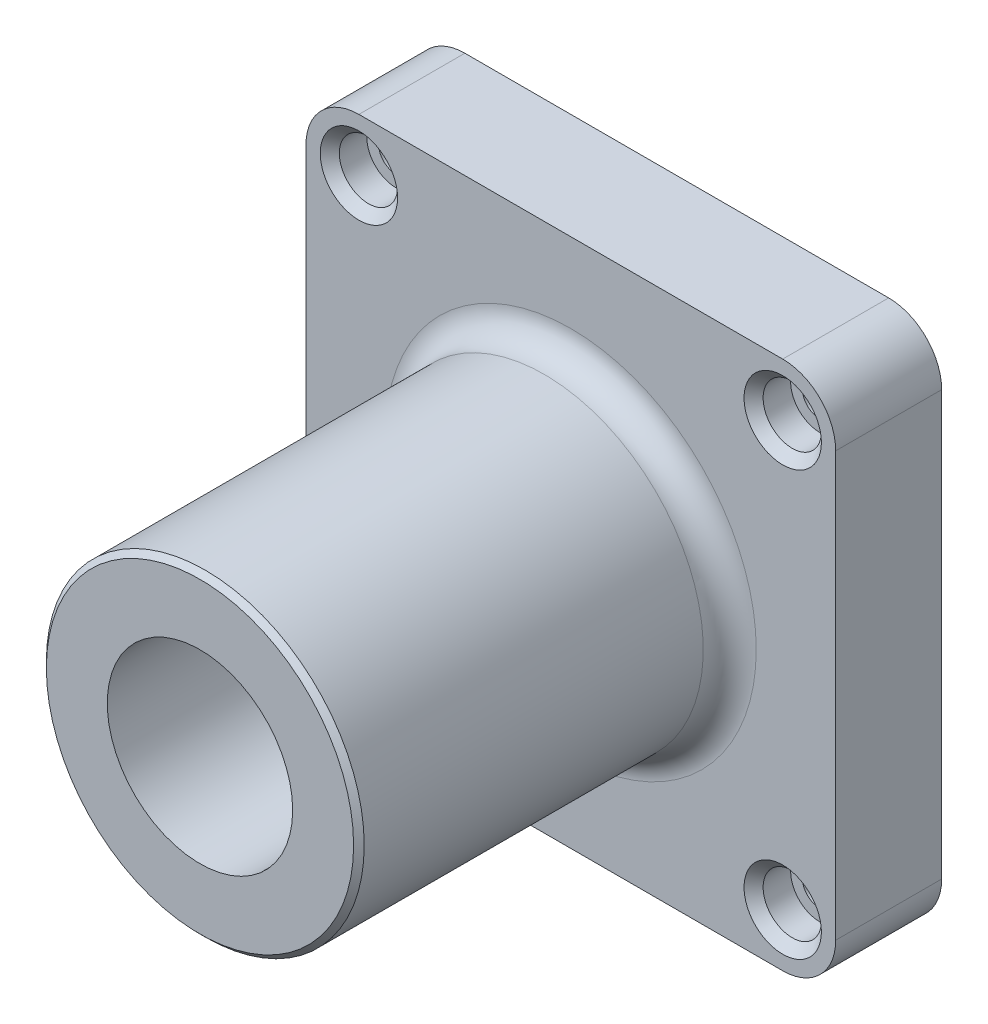
ISO-10303-21;
HEADER;
FILE_DESCRIPTION(('STEP AP214'),'2;1');
FILE_NAME('part.step','',(''),(''),'','','');
FILE_SCHEMA(('AUTOMOTIVE_DESIGN { 1 0 10303 214 1 1 1 1 }'));
ENDSEC;
DATA;
#1=APPLICATION_CONTEXT('core data for automotive mechanical design processes');
#2=APPLICATION_PROTOCOL_DEFINITION('international standard','automotive_design',2000,#1);
#3=PRODUCT_CONTEXT('',#1,'mechanical');
#4=PRODUCT('Part','Part','',(#3));
#5=PRODUCT_RELATED_PRODUCT_CATEGORY('part','',(#4));
#6=PRODUCT_DEFINITION_FORMATION('','',#4);
#7=PRODUCT_DEFINITION_CONTEXT('part definition',#1,'design');
#8=PRODUCT_DEFINITION('design','',#6,#7);
#9=PRODUCT_DEFINITION_SHAPE('','',#8);
#10=(LENGTH_UNIT() NAMED_UNIT(*) SI_UNIT(.MILLI.,.METRE.));
#11=(NAMED_UNIT(*) PLANE_ANGLE_UNIT() SI_UNIT($,.RADIAN.));
#12=(NAMED_UNIT(*) SI_UNIT($,.STERADIAN.) SOLID_ANGLE_UNIT());
#13=UNCERTAINTY_MEASURE_WITH_UNIT(LENGTH_MEASURE(1.E-05),#10,'distance_accuracy_value','');
#14=(GEOMETRIC_REPRESENTATION_CONTEXT(3) GLOBAL_UNCERTAINTY_ASSIGNED_CONTEXT((#13)) GLOBAL_UNIT_ASSIGNED_CONTEXT((#10,
#11,#12)) REPRESENTATION_CONTEXT('',''));
#15=CARTESIAN_POINT('',(0.,0.,0.));
#16=DIRECTION('',(0.,0.,1.));
#17=DIRECTION('',(1.,0.,0.));
#18=AXIS2_PLACEMENT_3D('',#15,#16,#17);
#19=CARTESIAN_POINT('',(0.,0.,20.));
#20=DIRECTION('',(1.,0.,0.));
#21=DIRECTION('',(0.,0.,-1.));
#22=AXIS2_PLACEMENT_3D('',#19,#20,#21);
#23=PLANE('',#22);
#24=DIRECTION('',(0.,-1.,0.));
#25=VECTOR('',#24,1.);
#26=CARTESIAN_POINT('',(0.,0.,0.));
#27=LINE('',#26,#25);
#28=CARTESIAN_POINT('',(0.,90.,0.));
#29=VERTEX_POINT('',#28);
#30=CARTESIAN_POINT('',(0.,10.,0.));
#31=VERTEX_POINT('',#30);
#32=EDGE_CURVE('E173',#29,#31,#27,.T.);
#33=ORIENTED_EDGE('',*,*,#32,.T.);
#34=DIRECTION('',(0.,0.,-1.));
#35=VECTOR('',#34,1.);
#36=CARTESIAN_POINT('',(0.,10.,20.));
#37=LINE('',#36,#35);
#38=CARTESIAN_POINT('',(0.,10.,20.));
#39=VERTEX_POINT('',#38);
#40=EDGE_CURVE('E11',#31,#39,#37,.F.);
#41=ORIENTED_EDGE('',*,*,#40,.T.);
#42=DIRECTION('',(0.,-1.,0.));
#43=VECTOR('',#42,1.);
#44=CARTESIAN_POINT('',(0.,0.,20.));
#45=LINE('',#44,#43);
#46=CARTESIAN_POINT('',(0.,90.,20.));
#47=VERTEX_POINT('',#46);
#48=EDGE_CURVE('E129',#47,#39,#45,.T.);
#49=ORIENTED_EDGE('',*,*,#48,.F.);
#50=DIRECTION('',(0.,0.,-1.));
#51=VECTOR('',#50,1.);
#52=CARTESIAN_POINT('',(0.,90.,20.));
#53=LINE('',#52,#51);
#54=EDGE_CURVE('E45',#47,#29,#53,.T.);
#55=ORIENTED_EDGE('',*,*,#54,.T.);
#56=EDGE_LOOP('',(#33,#41,#49,#55));
#57=FACE_BOUND('',#56,.T.);
#58=ADVANCED_FACE('F37',(#57),#23,.F.);
#59=CARTESIAN_POINT('',(0.,0.,20.));
#60=DIRECTION('',(0.,1.,0.));
#61=DIRECTION('',(0.,0.,1.));
#62=AXIS2_PLACEMENT_3D('',#59,#60,#61);
#63=PLANE('',#62);
#64=DIRECTION('',(1.,0.,0.));
#65=VECTOR('',#64,1.);
#66=CARTESIAN_POINT('',(0.,0.,0.));
#67=LINE('',#66,#65);
#68=CARTESIAN_POINT('',(10.,0.,0.));
#69=VERTEX_POINT('',#68);
#70=CARTESIAN_POINT('',(90.,0.,0.));
#71=VERTEX_POINT('',#70);
#72=EDGE_CURVE('E134',#69,#71,#67,.T.);
#73=ORIENTED_EDGE('',*,*,#72,.T.);
#74=DIRECTION('',(0.,0.,-1.));
#75=VECTOR('',#74,1.);
#76=CARTESIAN_POINT('',(90.,0.,20.));
#77=LINE('',#76,#75);
#78=CARTESIAN_POINT('',(90.,0.,20.));
#79=VERTEX_POINT('',#78);
#80=EDGE_CURVE('E52',#71,#79,#77,.F.);
#81=ORIENTED_EDGE('',*,*,#80,.T.);
#82=DIRECTION('',(1.,0.,0.));
#83=VECTOR('',#82,1.);
#84=CARTESIAN_POINT('',(0.,0.,20.));
#85=LINE('',#84,#83);
#86=CARTESIAN_POINT('',(10.,0.,20.));
#87=VERTEX_POINT('',#86);
#88=EDGE_CURVE('E132',#87,#79,#85,.T.);
#89=ORIENTED_EDGE('',*,*,#88,.F.);
#90=DIRECTION('',(0.,0.,-1.));
#91=VECTOR('',#90,1.);
#92=CARTESIAN_POINT('',(10.,0.,20.));
#93=LINE('',#92,#91);
#94=EDGE_CURVE('E165',#87,#69,#93,.T.);
#95=ORIENTED_EDGE('',*,*,#94,.T.);
#96=EDGE_LOOP('',(#73,#81,#89,#95));
#97=FACE_BOUND('',#96,.T.);
#98=ADVANCED_FACE('F274',(#97),#63,.F.);
#99=CARTESIAN_POINT('',(100.,0.,20.));
#100=DIRECTION('',(-1.,0.,0.));
#101=DIRECTION('',(0.,0.,1.));
#102=AXIS2_PLACEMENT_3D('',#99,#100,#101);
#103=PLANE('',#102);
#104=DIRECTION('',(0.,1.,0.));
#105=VECTOR('',#104,1.);
#106=CARTESIAN_POINT('',(100.,0.,0.));
#107=LINE('',#106,#105);
#108=CARTESIAN_POINT('',(100.,10.,0.));
#109=VERTEX_POINT('',#108);
#110=CARTESIAN_POINT('',(100.,90.,0.));
#111=VERTEX_POINT('',#110);
#112=EDGE_CURVE('E130',#109,#111,#107,.T.);
#113=ORIENTED_EDGE('',*,*,#112,.T.);
#114=DIRECTION('',(0.,0.,-1.));
#115=VECTOR('',#114,1.);
#116=CARTESIAN_POINT('',(100.,90.,20.));
#117=LINE('',#116,#115);
#118=CARTESIAN_POINT('',(100.,90.,20.));
#119=VERTEX_POINT('',#118);
#120=EDGE_CURVE('E108',#111,#119,#117,.F.);
#121=ORIENTED_EDGE('',*,*,#120,.T.);
#122=DIRECTION('',(0.,1.,0.));
#123=VECTOR('',#122,1.);
#124=CARTESIAN_POINT('',(100.,0.,20.));
#125=LINE('',#124,#123);
#126=CARTESIAN_POINT('',(100.,10.,20.));
#127=VERTEX_POINT('',#126);
#128=EDGE_CURVE('E185',#127,#119,#125,.T.);
#129=ORIENTED_EDGE('',*,*,#128,.F.);
#130=DIRECTION('',(0.,0.,-1.));
#131=VECTOR('',#130,1.);
#132=CARTESIAN_POINT('',(100.,10.,20.));
#133=LINE('',#132,#131);
#134=EDGE_CURVE('E113',#127,#109,#133,.T.);
#135=ORIENTED_EDGE('',*,*,#134,.T.);
#136=EDGE_LOOP('',(#113,#121,#129,#135));
#137=FACE_BOUND('',#136,.T.);
#138=ADVANCED_FACE('F279',(#137),#103,.F.);
#139=CARTESIAN_POINT('',(0.,100.,20.));
#140=DIRECTION('',(0.,-1.,0.));
#141=DIRECTION('',(0.,0.,-1.));
#142=AXIS2_PLACEMENT_3D('',#139,#140,#141);
#143=PLANE('',#142);
#144=DIRECTION('',(-1.,0.,0.));
#145=VECTOR('',#144,1.);
#146=CARTESIAN_POINT('',(0.,100.,20.));
#147=LINE('',#146,#145);
#148=CARTESIAN_POINT('',(90.,100.,20.));
#149=VERTEX_POINT('',#148);
#150=CARTESIAN_POINT('',(10.,100.,20.));
#151=VERTEX_POINT('',#150);
#152=EDGE_CURVE('E123',#149,#151,#147,.T.);
#153=ORIENTED_EDGE('',*,*,#152,.F.);
#154=DIRECTION('',(0.,0.,-1.));
#155=VECTOR('',#154,1.);
#156=CARTESIAN_POINT('',(90.,100.,20.));
#157=LINE('',#156,#155);
#158=CARTESIAN_POINT('',(90.,100.,0.));
#159=VERTEX_POINT('',#158);
#160=EDGE_CURVE('E107',#149,#159,#157,.T.);
#161=ORIENTED_EDGE('',*,*,#160,.T.);
#162=DIRECTION('',(-1.,0.,0.));
#163=VECTOR('',#162,1.);
#164=CARTESIAN_POINT('',(0.,100.,0.));
#165=LINE('',#164,#163);
#166=CARTESIAN_POINT('',(10.,100.,0.));
#167=VERTEX_POINT('',#166);
#168=EDGE_CURVE('E120',#159,#167,#165,.T.);
#169=ORIENTED_EDGE('',*,*,#168,.T.);
#170=DIRECTION('',(0.,0.,-1.));
#171=VECTOR('',#170,1.);
#172=CARTESIAN_POINT('',(10.,100.,20.));
#173=LINE('',#172,#171);
#174=EDGE_CURVE('E125',#167,#151,#173,.F.);
#175=ORIENTED_EDGE('',*,*,#174,.T.);
#176=EDGE_LOOP('',(#153,#161,#169,#175));
#177=FACE_BOUND('',#176,.T.);
#178=ADVANCED_FACE('F119',(#177),#143,.F.);
#179=CARTESIAN_POINT('',(0.,0.,20.));
#180=DIRECTION('',(0.,0.,-1.));
#181=DIRECTION('',(-1.,0.,0.));
#182=AXIS2_PLACEMENT_3D('',#179,#180,#181);
#183=PLANE('',#182);
#184=CARTESIAN_POINT('',(10.,90.,20.));
#185=DIRECTION('',(0.,0.,1.));
#186=DIRECTION('',(1.,0.,0.));
#187=AXIS2_PLACEMENT_3D('',#184,#185,#186);
#188=CIRCLE('',#187,7.3);
#189=CARTESIAN_POINT('',(17.3,90.,20.));
#190=VERTEX_POINT('',#189);
#191=EDGE_CURVE('E242',#190,#190,#188,.T.);
#192=ORIENTED_EDGE('',*,*,#191,.F.);
#193=EDGE_LOOP('',(#192));
#194=FACE_BOUND('',#193,.T.);
#195=CARTESIAN_POINT('',(10.,10.,20.));
#196=DIRECTION('',(0.,0.,1.));
#197=DIRECTION('',(1.,0.,0.));
#198=AXIS2_PLACEMENT_3D('',#195,#196,#197);
#199=CIRCLE('',#198,7.3);
#200=CARTESIAN_POINT('',(17.3,10.,20.));
#201=VERTEX_POINT('',#200);
#202=EDGE_CURVE('E227',#201,#201,#199,.T.);
#203=ORIENTED_EDGE('',*,*,#202,.F.);
#204=EDGE_LOOP('',(#203));
#205=FACE_BOUND('',#204,.T.);
#206=CARTESIAN_POINT('',(90.,10.,20.));
#207=DIRECTION('',(0.,0.,1.));
#208=DIRECTION('',(1.,0.,0.));
#209=AXIS2_PLACEMENT_3D('',#206,#207,#208);
#210=CIRCLE('',#209,7.3);
#211=CARTESIAN_POINT('',(97.3,10.,20.));
#212=VERTEX_POINT('',#211);
#213=EDGE_CURVE('E212',#212,#212,#210,.T.);
#214=ORIENTED_EDGE('',*,*,#213,.F.);
#215=EDGE_LOOP('',(#214));
#216=FACE_BOUND('',#215,.T.);
#217=CARTESIAN_POINT('',(90.,90.,20.));
#218=DIRECTION('',(0.,0.,1.));
#219=DIRECTION('',(1.,0.,0.));
#220=AXIS2_PLACEMENT_3D('',#217,#218,#219);
#221=CIRCLE('',#220,7.3);
#222=CARTESIAN_POINT('',(97.3,90.,20.));
#223=VERTEX_POINT('',#222);
#224=EDGE_CURVE('E197',#223,#223,#221,.T.);
#225=ORIENTED_EDGE('',*,*,#224,.F.);
#226=EDGE_LOOP('',(#225));
#227=FACE_BOUND('',#226,.T.);
#228=CARTESIAN_POINT('',(50.,50.,20.));
#229=DIRECTION('',(0.,0.,-1.));
#230=DIRECTION('',(-1.,0.,0.));
#231=AXIS2_PLACEMENT_3D('',#228,#229,#230);
#232=CIRCLE('',#231,35.);
#233=CARTESIAN_POINT('',(15.,50.,20.));
#234=VERTEX_POINT('',#233);
#235=EDGE_CURVE('E141',#234,#234,#232,.T.);
#236=ORIENTED_EDGE('',*,*,#235,.T.);
#237=EDGE_LOOP('',(#236));
#238=FACE_BOUND('',#237,.T.);
#239=ORIENTED_EDGE('',*,*,#128,.T.);
#240=CARTESIAN_POINT('',(90.,90.,20.));
#241=DIRECTION('',(0.,0.,-1.));
#242=DIRECTION('',(-1.,0.,0.));
#243=AXIS2_PLACEMENT_3D('',#240,#241,#242);
#244=CIRCLE('',#243,10.);
#245=EDGE_CURVE('E163',#119,#149,#244,.F.);
#246=ORIENTED_EDGE('',*,*,#245,.T.);
#247=ORIENTED_EDGE('',*,*,#152,.T.);
#248=CARTESIAN_POINT('',(10.,90.,20.));
#249=DIRECTION('',(0.,0.,-1.));
#250=DIRECTION('',(-1.,0.,0.));
#251=AXIS2_PLACEMENT_3D('',#248,#249,#250);
#252=CIRCLE('',#251,10.);
#253=EDGE_CURVE('E158',#151,#47,#252,.F.);
#254=ORIENTED_EDGE('',*,*,#253,.T.);
#255=ORIENTED_EDGE('',*,*,#48,.T.);
#256=CARTESIAN_POINT('',(10.,10.,20.));
#257=DIRECTION('',(0.,0.,-1.));
#258=DIRECTION('',(-1.,0.,0.));
#259=AXIS2_PLACEMENT_3D('',#256,#257,#258);
#260=CIRCLE('',#259,10.);
#261=EDGE_CURVE('E59',#39,#87,#260,.F.);
#262=ORIENTED_EDGE('',*,*,#261,.T.);
#263=ORIENTED_EDGE('',*,*,#88,.T.);
#264=CARTESIAN_POINT('',(90.,10.,20.));
#265=DIRECTION('',(0.,0.,-1.));
#266=DIRECTION('',(-1.,0.,0.));
#267=AXIS2_PLACEMENT_3D('',#264,#265,#266);
#268=CIRCLE('',#267,10.);
#269=EDGE_CURVE('E161',#79,#127,#268,.F.);
#270=ORIENTED_EDGE('',*,*,#269,.T.);
#271=EDGE_LOOP('',(#239,#246,#247,#254,#255,#262,#263,#270));
#272=FACE_BOUND('',#271,.T.);
#273=ADVANCED_FACE('F312',(#194,#205,#216,#227,#238,#272),#183,.F.);
#274=CARTESIAN_POINT('',(0.,0.,0.));
#275=DIRECTION('',(0.,0.,-1.));
#276=DIRECTION('',(-1.,0.,0.));
#277=AXIS2_PLACEMENT_3D('',#274,#275,#276);
#278=PLANE('',#277);
#279=CARTESIAN_POINT('',(50.,50.,0.));
#280=DIRECTION('',(0.,0.,1.));
#281=DIRECTION('',(1.,0.,0.));
#282=AXIS2_PLACEMENT_3D('',#279,#280,#281);
#283=CIRCLE('',#282,22.5);
#284=CARTESIAN_POINT('',(72.5,50.,0.));
#285=VERTEX_POINT('',#284);
#286=EDGE_CURVE('E251',#285,#285,#283,.T.);
#287=ORIENTED_EDGE('',*,*,#286,.T.);
#288=EDGE_LOOP('',(#287));
#289=FACE_BOUND('',#288,.T.);
#290=CARTESIAN_POINT('',(10.,90.,0.));
#291=DIRECTION('',(0.,0.,1.));
#292=DIRECTION('',(1.,0.,0.));
#293=AXIS2_PLACEMENT_3D('',#290,#291,#292);
#294=CIRCLE('',#293,3.3);
#295=CARTESIAN_POINT('',(13.3,90.,0.));
#296=VERTEX_POINT('',#295);
#297=EDGE_CURVE('E230',#296,#296,#294,.T.);
#298=ORIENTED_EDGE('',*,*,#297,.T.);
#299=EDGE_LOOP('',(#298));
#300=FACE_BOUND('',#299,.T.);
#301=CARTESIAN_POINT('',(10.,10.,0.));
#302=DIRECTION('',(0.,0.,1.));
#303=DIRECTION('',(1.,0.,0.));
#304=AXIS2_PLACEMENT_3D('',#301,#302,#303);
#305=CIRCLE('',#304,3.3);
#306=CARTESIAN_POINT('',(13.3,10.,0.));
#307=VERTEX_POINT('',#306);
#308=EDGE_CURVE('E215',#307,#307,#305,.T.);
#309=ORIENTED_EDGE('',*,*,#308,.T.);
#310=EDGE_LOOP('',(#309));
#311=FACE_BOUND('',#310,.T.);
#312=CARTESIAN_POINT('',(90.,10.,0.));
#313=DIRECTION('',(0.,0.,1.));
#314=DIRECTION('',(1.,0.,0.));
#315=AXIS2_PLACEMENT_3D('',#312,#313,#314);
#316=CIRCLE('',#315,3.3);
#317=CARTESIAN_POINT('',(93.3,10.,0.));
#318=VERTEX_POINT('',#317);
#319=EDGE_CURVE('E200',#318,#318,#316,.T.);
#320=ORIENTED_EDGE('',*,*,#319,.T.);
#321=EDGE_LOOP('',(#320));
#322=FACE_BOUND('',#321,.T.);
#323=CARTESIAN_POINT('',(90.,90.,0.));
#324=DIRECTION('',(0.,0.,1.));
#325=DIRECTION('',(1.,0.,0.));
#326=AXIS2_PLACEMENT_3D('',#323,#324,#325);
#327=CIRCLE('',#326,3.3);
#328=CARTESIAN_POINT('',(93.3,90.,0.));
#329=VERTEX_POINT('',#328);
#330=EDGE_CURVE('E178',#329,#329,#327,.T.);
#331=ORIENTED_EDGE('',*,*,#330,.T.);
#332=EDGE_LOOP('',(#331));
#333=FACE_BOUND('',#332,.T.);
#334=ORIENTED_EDGE('',*,*,#168,.F.);
#335=CARTESIAN_POINT('',(90.,90.,0.));
#336=DIRECTION('',(0.,0.,-1.));
#337=DIRECTION('',(-1.,0.,0.));
#338=AXIS2_PLACEMENT_3D('',#335,#336,#337);
#339=CIRCLE('',#338,10.);
#340=EDGE_CURVE('E103',#159,#111,#339,.T.);
#341=ORIENTED_EDGE('',*,*,#340,.T.);
#342=ORIENTED_EDGE('',*,*,#112,.F.);
#343=CARTESIAN_POINT('',(90.,10.,0.));
#344=DIRECTION('',(0.,0.,-1.));
#345=DIRECTION('',(-1.,0.,0.));
#346=AXIS2_PLACEMENT_3D('',#343,#344,#345);
#347=CIRCLE('',#346,10.);
#348=EDGE_CURVE('E114',#109,#71,#347,.T.);
#349=ORIENTED_EDGE('',*,*,#348,.T.);
#350=ORIENTED_EDGE('',*,*,#72,.F.);
#351=CARTESIAN_POINT('',(10.,10.,0.));
#352=DIRECTION('',(0.,0.,-1.));
#353=DIRECTION('',(-1.,0.,0.));
#354=AXIS2_PLACEMENT_3D('',#351,#352,#353);
#355=CIRCLE('',#354,10.);
#356=EDGE_CURVE('E152',#69,#31,#355,.T.);
#357=ORIENTED_EDGE('',*,*,#356,.T.);
#358=ORIENTED_EDGE('',*,*,#32,.F.);
#359=CARTESIAN_POINT('',(10.,90.,0.));
#360=DIRECTION('',(0.,0.,-1.));
#361=DIRECTION('',(-1.,0.,0.));
#362=AXIS2_PLACEMENT_3D('',#359,#360,#361);
#363=CIRCLE('',#362,10.);
#364=EDGE_CURVE('E124',#29,#167,#363,.T.);
#365=ORIENTED_EDGE('',*,*,#364,.T.);
#366=EDGE_LOOP('',(#334,#341,#342,#349,#350,#357,#358,#365));
#367=FACE_BOUND('',#366,.T.);
#368=ADVANCED_FACE('F127',(#289,#300,#311,#322,#333,#367),#278,.T.);
#369=CARTESIAN_POINT('',(50.,50.,90.));
#370=DIRECTION('',(0.,0.,-1.));
#371=DIRECTION('',(-1.,0.,0.));
#372=AXIS2_PLACEMENT_3D('',#369,#370,#371);
#373=CYLINDRICAL_SURFACE('',#372,30.);
#374=CARTESIAN_POINT('',(50.,50.,89.));
#375=DIRECTION('',(0.,0.,1.));
#376=DIRECTION('',(1.,0.,0.));
#377=AXIS2_PLACEMENT_3D('',#374,#375,#376);
#378=CIRCLE('',#377,30.);
#379=CARTESIAN_POINT('',(80.,50.,89.));
#380=VERTEX_POINT('',#379);
#381=EDGE_CURVE('E147',#380,#380,#378,.F.);
#382=ORIENTED_EDGE('',*,*,#381,.T.);
#383=EDGE_LOOP('',(#382));
#384=FACE_BOUND('',#383,.T.);
#385=CARTESIAN_POINT('',(50.,50.,25.));
#386=DIRECTION('',(0.,0.,-1.));
#387=DIRECTION('',(-1.,0.,0.));
#388=AXIS2_PLACEMENT_3D('',#385,#386,#387);
#389=CIRCLE('',#388,30.);
#390=CARTESIAN_POINT('',(20.,50.,25.));
#391=VERTEX_POINT('',#390);
#392=EDGE_CURVE('E138',#391,#391,#389,.F.);
#393=ORIENTED_EDGE('',*,*,#392,.T.);
#394=EDGE_LOOP('',(#393));
#395=FACE_BOUND('',#394,.T.);
#396=ADVANCED_FACE('F320',(#384,#395),#373,.T.);
#397=CARTESIAN_POINT('',(50.,50.,90.));
#398=DIRECTION('',(0.,0.,1.));
#399=DIRECTION('',(1.,0.,0.));
#400=AXIS2_PLACEMENT_3D('',#397,#398,#399);
#401=PLANE('',#400);
#402=CARTESIAN_POINT('',(50.,50.,90.));
#403=DIRECTION('',(0.,0.,1.));
#404=DIRECTION('',(1.,0.,0.));
#405=AXIS2_PLACEMENT_3D('',#402,#403,#404);
#406=CIRCLE('',#405,17.5);
#407=CARTESIAN_POINT('',(67.5,50.,90.));
#408=VERTEX_POINT('',#407);
#409=EDGE_CURVE('E245',#408,#408,#406,.T.);
#410=ORIENTED_EDGE('',*,*,#409,.F.);
#411=EDGE_LOOP('',(#410));
#412=FACE_BOUND('',#411,.T.);
#413=CARTESIAN_POINT('',(50.,50.,90.));
#414=DIRECTION('',(0.,0.,1.));
#415=DIRECTION('',(1.,0.,0.));
#416=AXIS2_PLACEMENT_3D('',#413,#414,#415);
#417=CIRCLE('',#416,29.);
#418=CARTESIAN_POINT('',(79.,50.,90.));
#419=VERTEX_POINT('',#418);
#420=EDGE_CURVE('E144',#419,#419,#417,.T.);
#421=ORIENTED_EDGE('',*,*,#420,.T.);
#422=EDGE_LOOP('',(#421));
#423=FACE_BOUND('',#422,.T.);
#424=ADVANCED_FACE('F287',(#412,#423),#401,.T.);
#425=CARTESIAN_POINT('',(50.,50.,25.));
#426=DIRECTION('',(0.,0.,-1.));
#427=DIRECTION('',(-1.,0.,0.));
#428=AXIS2_PLACEMENT_3D('',#425,#426,#427);
#429=TOROIDAL_SURFACE('',#428,35.,5.);
#430=ORIENTED_EDGE('',*,*,#235,.F.);
#431=EDGE_LOOP('',(#430));
#432=FACE_BOUND('',#431,.T.);
#433=ORIENTED_EDGE('',*,*,#392,.F.);
#434=EDGE_LOOP('',(#433));
#435=FACE_BOUND('',#434,.T.);
#436=ADVANCED_FACE('F283',(#432,#435),#429,.F.);
#437=CARTESIAN_POINT('',(50.,50.,90.));
#438=DIRECTION('',(0.,0.,-1.));
#439=DIRECTION('',(-1.,0.,0.));
#440=AXIS2_PLACEMENT_3D('',#437,#438,#439);
#441=CONICAL_SURFACE('',#440,29.,0.785398163397447);
#442=ORIENTED_EDGE('',*,*,#381,.F.);
#443=EDGE_LOOP('',(#442));
#444=FACE_BOUND('',#443,.T.);
#445=ORIENTED_EDGE('',*,*,#420,.F.);
#446=EDGE_LOOP('',(#445));
#447=FACE_BOUND('',#446,.T.);
#448=ADVANCED_FACE('F286',(#444,#447),#441,.T.);
#449=CARTESIAN_POINT('',(90.,90.,20.));
#450=DIRECTION('',(0.,0.,-1.));
#451=DIRECTION('',(-1.,0.,0.));
#452=AXIS2_PLACEMENT_3D('',#449,#450,#451);
#453=CYLINDRICAL_SURFACE('',#452,10.);
#454=ORIENTED_EDGE('',*,*,#245,.F.);
#455=ORIENTED_EDGE('',*,*,#120,.F.);
#456=ORIENTED_EDGE('',*,*,#340,.F.);
#457=ORIENTED_EDGE('',*,*,#160,.F.);
#458=EDGE_LOOP('',(#454,#455,#456,#457));
#459=FACE_BOUND('',#458,.T.);
#460=ADVANCED_FACE('F106',(#459),#453,.T.);
#461=CARTESIAN_POINT('',(90.,10.,20.));
#462=DIRECTION('',(0.,0.,-1.));
#463=DIRECTION('',(-1.,0.,0.));
#464=AXIS2_PLACEMENT_3D('',#461,#462,#463);
#465=CYLINDRICAL_SURFACE('',#464,10.);
#466=ORIENTED_EDGE('',*,*,#269,.F.);
#467=ORIENTED_EDGE('',*,*,#80,.F.);
#468=ORIENTED_EDGE('',*,*,#348,.F.);
#469=ORIENTED_EDGE('',*,*,#134,.F.);
#470=EDGE_LOOP('',(#466,#467,#468,#469));
#471=FACE_BOUND('',#470,.T.);
#472=ADVANCED_FACE('F297',(#471),#465,.T.);
#473=CARTESIAN_POINT('',(10.,10.,20.));
#474=DIRECTION('',(0.,0.,-1.));
#475=DIRECTION('',(-1.,0.,0.));
#476=AXIS2_PLACEMENT_3D('',#473,#474,#475);
#477=CYLINDRICAL_SURFACE('',#476,10.);
#478=ORIENTED_EDGE('',*,*,#261,.F.);
#479=ORIENTED_EDGE('',*,*,#40,.F.);
#480=ORIENTED_EDGE('',*,*,#356,.F.);
#481=ORIENTED_EDGE('',*,*,#94,.F.);
#482=EDGE_LOOP('',(#478,#479,#480,#481));
#483=FACE_BOUND('',#482,.T.);
#484=ADVANCED_FACE('F299',(#483),#477,.T.);
#485=CARTESIAN_POINT('',(10.,90.,20.));
#486=DIRECTION('',(0.,0.,-1.));
#487=DIRECTION('',(-1.,0.,0.));
#488=AXIS2_PLACEMENT_3D('',#485,#486,#487);
#489=CYLINDRICAL_SURFACE('',#488,10.);
#490=ORIENTED_EDGE('',*,*,#253,.F.);
#491=ORIENTED_EDGE('',*,*,#174,.F.);
#492=ORIENTED_EDGE('',*,*,#364,.F.);
#493=ORIENTED_EDGE('',*,*,#54,.F.);
#494=EDGE_LOOP('',(#490,#491,#492,#493));
#495=FACE_BOUND('',#494,.T.);
#496=ADVANCED_FACE('F39',(#495),#489,.T.);
#497=CARTESIAN_POINT('',(90.,90.,20.));
#498=DIRECTION('',(0.,0.,1.));
#499=DIRECTION('',(1.,0.,0.));
#500=AXIS2_PLACEMENT_3D('',#497,#498,#499);
#501=CYLINDRICAL_SURFACE('',#500,3.3);
#502=ORIENTED_EDGE('',*,*,#330,.F.);
#503=EDGE_LOOP('',(#502));
#504=FACE_BOUND('',#503,.T.);
#505=CARTESIAN_POINT('',(90.,90.,13.));
#506=DIRECTION('',(0.,0.,1.));
#507=DIRECTION('',(1.,0.,0.));
#508=AXIS2_PLACEMENT_3D('',#505,#506,#507);
#509=CIRCLE('',#508,3.3);
#510=CARTESIAN_POINT('',(93.3,90.,13.));
#511=VERTEX_POINT('',#510);
#512=EDGE_CURVE('E181',#511,#511,#509,.T.);
#513=ORIENTED_EDGE('',*,*,#512,.T.);
#514=EDGE_LOOP('',(#513));
#515=FACE_BOUND('',#514,.T.);
#516=ADVANCED_FACE('F306',(#504,#515),#501,.F.);
#517=CARTESIAN_POINT('',(95.5,90.,13.));
#518=DIRECTION('',(0.,0.,-1.));
#519=DIRECTION('',(-1.,0.,0.));
#520=AXIS2_PLACEMENT_3D('',#517,#518,#519);
#521=PLANE('',#520);
#522=ORIENTED_EDGE('',*,*,#512,.F.);
#523=EDGE_LOOP('',(#522));
#524=FACE_BOUND('',#523,.T.);
#525=CARTESIAN_POINT('',(90.,90.,13.));
#526=DIRECTION('',(0.,0.,1.));
#527=DIRECTION('',(1.,0.,0.));
#528=AXIS2_PLACEMENT_3D('',#525,#526,#527);
#529=CIRCLE('',#528,5.50000000000001);
#530=CARTESIAN_POINT('',(95.5,90.,13.));
#531=VERTEX_POINT('',#530);
#532=EDGE_CURVE('E191',#531,#531,#529,.T.);
#533=ORIENTED_EDGE('',*,*,#532,.T.);
#534=EDGE_LOOP('',(#533));
#535=FACE_BOUND('',#534,.T.);
#536=ADVANCED_FACE('F373',(#524,#535),#521,.F.);
#537=CARTESIAN_POINT('',(90.,90.,20.));
#538=DIRECTION('',(0.,0.,1.));
#539=DIRECTION('',(1.,0.,0.));
#540=AXIS2_PLACEMENT_3D('',#537,#538,#539);
#541=CYLINDRICAL_SURFACE('',#540,5.50000000000001);
#542=ORIENTED_EDGE('',*,*,#532,.F.);
#543=EDGE_LOOP('',(#542));
#544=FACE_BOUND('',#543,.T.);
#545=CARTESIAN_POINT('',(90.,90.,18.2));
#546=DIRECTION('',(0.,0.,1.));
#547=DIRECTION('',(1.,0.,0.));
#548=AXIS2_PLACEMENT_3D('',#545,#546,#547);
#549=CIRCLE('',#548,5.50000000000001);
#550=CARTESIAN_POINT('',(95.5,90.,18.2));
#551=VERTEX_POINT('',#550);
#552=EDGE_CURVE('E194',#551,#551,#549,.T.);
#553=ORIENTED_EDGE('',*,*,#552,.T.);
#554=EDGE_LOOP('',(#553));
#555=FACE_BOUND('',#554,.T.);
#556=ADVANCED_FACE('F383',(#544,#555),#541,.F.);
#557=CARTESIAN_POINT('',(90.,90.,20.));
#558=DIRECTION('',(0.,0.,1.));
#559=DIRECTION('',(1.,0.,0.));
#560=AXIS2_PLACEMENT_3D('',#557,#558,#559);
#561=CONICAL_SURFACE('',#560,7.3,0.785398163397446);
#562=ORIENTED_EDGE('',*,*,#552,.F.);
#563=EDGE_LOOP('',(#562));
#564=FACE_BOUND('',#563,.T.);
#565=ORIENTED_EDGE('',*,*,#224,.T.);
#566=EDGE_LOOP('',(#565));
#567=FACE_BOUND('',#566,.T.);
#568=ADVANCED_FACE('F393',(#564,#567),#561,.F.);
#569=CARTESIAN_POINT('',(90.,10.,20.));
#570=DIRECTION('',(0.,0.,1.));
#571=DIRECTION('',(1.,0.,0.));
#572=AXIS2_PLACEMENT_3D('',#569,#570,#571);
#573=CYLINDRICAL_SURFACE('',#572,3.3);
#574=ORIENTED_EDGE('',*,*,#319,.F.);
#575=EDGE_LOOP('',(#574));
#576=FACE_BOUND('',#575,.T.);
#577=CARTESIAN_POINT('',(90.,10.,13.));
#578=DIRECTION('',(0.,0.,1.));
#579=DIRECTION('',(1.,0.,0.));
#580=AXIS2_PLACEMENT_3D('',#577,#578,#579);
#581=CIRCLE('',#580,3.3);
#582=CARTESIAN_POINT('',(93.3,10.,13.));
#583=VERTEX_POINT('',#582);
#584=EDGE_CURVE('E203',#583,#583,#581,.T.);
#585=ORIENTED_EDGE('',*,*,#584,.T.);
#586=EDGE_LOOP('',(#585));
#587=FACE_BOUND('',#586,.T.);
#588=ADVANCED_FACE('F403',(#576,#587),#573,.F.);
#589=CARTESIAN_POINT('',(95.5,10.,13.));
#590=DIRECTION('',(0.,0.,-1.));
#591=DIRECTION('',(-1.,0.,0.));
#592=AXIS2_PLACEMENT_3D('',#589,#590,#591);
#593=PLANE('',#592);
#594=ORIENTED_EDGE('',*,*,#584,.F.);
#595=EDGE_LOOP('',(#594));
#596=FACE_BOUND('',#595,.T.);
#597=CARTESIAN_POINT('',(90.,10.,13.));
#598=DIRECTION('',(0.,0.,1.));
#599=DIRECTION('',(1.,0.,0.));
#600=AXIS2_PLACEMENT_3D('',#597,#598,#599);
#601=CIRCLE('',#600,5.50000000000001);
#602=CARTESIAN_POINT('',(95.5,10.,13.));
#603=VERTEX_POINT('',#602);
#604=EDGE_CURVE('E206',#603,#603,#601,.T.);
#605=ORIENTED_EDGE('',*,*,#604,.T.);
#606=EDGE_LOOP('',(#605));
#607=FACE_BOUND('',#606,.T.);
#608=ADVANCED_FACE('F413',(#596,#607),#593,.F.);
#609=CARTESIAN_POINT('',(90.,10.,20.));
#610=DIRECTION('',(0.,0.,1.));
#611=DIRECTION('',(1.,0.,0.));
#612=AXIS2_PLACEMENT_3D('',#609,#610,#611);
#613=CYLINDRICAL_SURFACE('',#612,5.50000000000001);
#614=ORIENTED_EDGE('',*,*,#604,.F.);
#615=EDGE_LOOP('',(#614));
#616=FACE_BOUND('',#615,.T.);
#617=CARTESIAN_POINT('',(90.,10.,18.2));
#618=DIRECTION('',(0.,0.,1.));
#619=DIRECTION('',(1.,0.,0.));
#620=AXIS2_PLACEMENT_3D('',#617,#618,#619);
#621=CIRCLE('',#620,5.50000000000001);
#622=CARTESIAN_POINT('',(95.5,10.,18.2));
#623=VERTEX_POINT('',#622);
#624=EDGE_CURVE('E209',#623,#623,#621,.T.);
#625=ORIENTED_EDGE('',*,*,#624,.T.);
#626=EDGE_LOOP('',(#625));
#627=FACE_BOUND('',#626,.T.);
#628=ADVANCED_FACE('F423',(#616,#627),#613,.F.);
#629=CARTESIAN_POINT('',(90.,10.,20.));
#630=DIRECTION('',(0.,0.,1.));
#631=DIRECTION('',(1.,0.,0.));
#632=AXIS2_PLACEMENT_3D('',#629,#630,#631);
#633=CONICAL_SURFACE('',#632,7.3,0.785398163397446);
#634=ORIENTED_EDGE('',*,*,#624,.F.);
#635=EDGE_LOOP('',(#634));
#636=FACE_BOUND('',#635,.T.);
#637=ORIENTED_EDGE('',*,*,#213,.T.);
#638=EDGE_LOOP('',(#637));
#639=FACE_BOUND('',#638,.T.);
#640=ADVANCED_FACE('F433',(#636,#639),#633,.F.);
#641=CARTESIAN_POINT('',(10.,10.,20.));
#642=DIRECTION('',(0.,0.,1.));
#643=DIRECTION('',(1.,0.,0.));
#644=AXIS2_PLACEMENT_3D('',#641,#642,#643);
#645=CYLINDRICAL_SURFACE('',#644,3.3);
#646=ORIENTED_EDGE('',*,*,#308,.F.);
#647=EDGE_LOOP('',(#646));
#648=FACE_BOUND('',#647,.T.);
#649=CARTESIAN_POINT('',(10.,10.,13.));
#650=DIRECTION('',(0.,0.,1.));
#651=DIRECTION('',(1.,0.,0.));
#652=AXIS2_PLACEMENT_3D('',#649,#650,#651);
#653=CIRCLE('',#652,3.3);
#654=CARTESIAN_POINT('',(13.3,10.,13.));
#655=VERTEX_POINT('',#654);
#656=EDGE_CURVE('E218',#655,#655,#653,.T.);
#657=ORIENTED_EDGE('',*,*,#656,.T.);
#658=EDGE_LOOP('',(#657));
#659=FACE_BOUND('',#658,.T.);
#660=ADVANCED_FACE('F443',(#648,#659),#645,.F.);
#661=CARTESIAN_POINT('',(15.5,10.,13.));
#662=DIRECTION('',(0.,0.,-1.));
#663=DIRECTION('',(-1.,0.,0.));
#664=AXIS2_PLACEMENT_3D('',#661,#662,#663);
#665=PLANE('',#664);
#666=ORIENTED_EDGE('',*,*,#656,.F.);
#667=EDGE_LOOP('',(#666));
#668=FACE_BOUND('',#667,.T.);
#669=CARTESIAN_POINT('',(10.,10.,13.));
#670=DIRECTION('',(0.,0.,1.));
#671=DIRECTION('',(1.,0.,0.));
#672=AXIS2_PLACEMENT_3D('',#669,#670,#671);
#673=CIRCLE('',#672,5.5);
#674=CARTESIAN_POINT('',(15.5,10.,13.));
#675=VERTEX_POINT('',#674);
#676=EDGE_CURVE('E221',#675,#675,#673,.T.);
#677=ORIENTED_EDGE('',*,*,#676,.T.);
#678=EDGE_LOOP('',(#677));
#679=FACE_BOUND('',#678,.T.);
#680=ADVANCED_FACE('F453',(#668,#679),#665,.F.);
#681=CARTESIAN_POINT('',(10.,10.,20.));
#682=DIRECTION('',(0.,0.,1.));
#683=DIRECTION('',(1.,0.,0.));
#684=AXIS2_PLACEMENT_3D('',#681,#682,#683);
#685=CYLINDRICAL_SURFACE('',#684,5.5);
#686=ORIENTED_EDGE('',*,*,#676,.F.);
#687=EDGE_LOOP('',(#686));
#688=FACE_BOUND('',#687,.T.);
#689=CARTESIAN_POINT('',(10.,10.,18.2));
#690=DIRECTION('',(0.,0.,1.));
#691=DIRECTION('',(1.,0.,0.));
#692=AXIS2_PLACEMENT_3D('',#689,#690,#691);
#693=CIRCLE('',#692,5.5);
#694=CARTESIAN_POINT('',(15.5,10.,18.2));
#695=VERTEX_POINT('',#694);
#696=EDGE_CURVE('E224',#695,#695,#693,.T.);
#697=ORIENTED_EDGE('',*,*,#696,.T.);
#698=EDGE_LOOP('',(#697));
#699=FACE_BOUND('',#698,.T.);
#700=ADVANCED_FACE('F463',(#688,#699),#685,.F.);
#701=CARTESIAN_POINT('',(10.,10.,20.));
#702=DIRECTION('',(0.,0.,1.));
#703=DIRECTION('',(1.,0.,0.));
#704=AXIS2_PLACEMENT_3D('',#701,#702,#703);
#705=CONICAL_SURFACE('',#704,7.3,0.785398163397448);
#706=ORIENTED_EDGE('',*,*,#696,.F.);
#707=EDGE_LOOP('',(#706));
#708=FACE_BOUND('',#707,.T.);
#709=ORIENTED_EDGE('',*,*,#202,.T.);
#710=EDGE_LOOP('',(#709));
#711=FACE_BOUND('',#710,.T.);
#712=ADVANCED_FACE('F473',(#708,#711),#705,.F.);
#713=CARTESIAN_POINT('',(10.,90.,20.));
#714=DIRECTION('',(0.,0.,1.));
#715=DIRECTION('',(1.,0.,0.));
#716=AXIS2_PLACEMENT_3D('',#713,#714,#715);
#717=CYLINDRICAL_SURFACE('',#716,3.3);
#718=ORIENTED_EDGE('',*,*,#297,.F.);
#719=EDGE_LOOP('',(#718));
#720=FACE_BOUND('',#719,.T.);
#721=CARTESIAN_POINT('',(10.,90.,13.));
#722=DIRECTION('',(0.,0.,1.));
#723=DIRECTION('',(1.,0.,0.));
#724=AXIS2_PLACEMENT_3D('',#721,#722,#723);
#725=CIRCLE('',#724,3.3);
#726=CARTESIAN_POINT('',(13.3,90.,13.));
#727=VERTEX_POINT('',#726);
#728=EDGE_CURVE('E233',#727,#727,#725,.T.);
#729=ORIENTED_EDGE('',*,*,#728,.T.);
#730=EDGE_LOOP('',(#729));
#731=FACE_BOUND('',#730,.T.);
#732=ADVANCED_FACE('F483',(#720,#731),#717,.F.);
#733=CARTESIAN_POINT('',(15.5,90.,13.));
#734=DIRECTION('',(0.,0.,-1.));
#735=DIRECTION('',(-1.,0.,0.));
#736=AXIS2_PLACEMENT_3D('',#733,#734,#735);
#737=PLANE('',#736);
#738=ORIENTED_EDGE('',*,*,#728,.F.);
#739=EDGE_LOOP('',(#738));
#740=FACE_BOUND('',#739,.T.);
#741=CARTESIAN_POINT('',(10.,90.,13.));
#742=DIRECTION('',(0.,0.,1.));
#743=DIRECTION('',(1.,0.,0.));
#744=AXIS2_PLACEMENT_3D('',#741,#742,#743);
#745=CIRCLE('',#744,5.5);
#746=CARTESIAN_POINT('',(15.5,90.,13.));
#747=VERTEX_POINT('',#746);
#748=EDGE_CURVE('E236',#747,#747,#745,.T.);
#749=ORIENTED_EDGE('',*,*,#748,.T.);
#750=EDGE_LOOP('',(#749));
#751=FACE_BOUND('',#750,.T.);
#752=ADVANCED_FACE('F493',(#740,#751),#737,.F.);
#753=CARTESIAN_POINT('',(10.,90.,20.));
#754=DIRECTION('',(0.,0.,1.));
#755=DIRECTION('',(1.,0.,0.));
#756=AXIS2_PLACEMENT_3D('',#753,#754,#755);
#757=CYLINDRICAL_SURFACE('',#756,5.5);
#758=ORIENTED_EDGE('',*,*,#748,.F.);
#759=EDGE_LOOP('',(#758));
#760=FACE_BOUND('',#759,.T.);
#761=CARTESIAN_POINT('',(10.,90.,18.2));
#762=DIRECTION('',(0.,0.,1.));
#763=DIRECTION('',(1.,0.,0.));
#764=AXIS2_PLACEMENT_3D('',#761,#762,#763);
#765=CIRCLE('',#764,5.5);
#766=CARTESIAN_POINT('',(15.5,90.,18.2));
#767=VERTEX_POINT('',#766);
#768=EDGE_CURVE('E239',#767,#767,#765,.T.);
#769=ORIENTED_EDGE('',*,*,#768,.T.);
#770=EDGE_LOOP('',(#769));
#771=FACE_BOUND('',#770,.T.);
#772=ADVANCED_FACE('F503',(#760,#771),#757,.F.);
#773=CARTESIAN_POINT('',(10.,90.,20.));
#774=DIRECTION('',(0.,0.,1.));
#775=DIRECTION('',(1.,0.,0.));
#776=AXIS2_PLACEMENT_3D('',#773,#774,#775);
#777=CONICAL_SURFACE('',#776,7.3,0.785398163397448);
#778=ORIENTED_EDGE('',*,*,#768,.F.);
#779=EDGE_LOOP('',(#778));
#780=FACE_BOUND('',#779,.T.);
#781=ORIENTED_EDGE('',*,*,#191,.T.);
#782=EDGE_LOOP('',(#781));
#783=FACE_BOUND('',#782,.T.);
#784=ADVANCED_FACE('F513',(#780,#783),#777,.F.);
#785=CARTESIAN_POINT('',(50.,50.,50.));
#786=DIRECTION('',(0.,0.,1.));
#787=DIRECTION('',(1.,0.,0.));
#788=AXIS2_PLACEMENT_3D('',#785,#786,#787);
#789=CYLINDRICAL_SURFACE('',#788,17.5);
#790=CARTESIAN_POINT('',(50.,50.,50.));
#791=DIRECTION('',(0.,0.,1.));
#792=DIRECTION('',(1.,0.,0.));
#793=AXIS2_PLACEMENT_3D('',#790,#791,#792);
#794=CIRCLE('',#793,17.5);
#795=CARTESIAN_POINT('',(67.5,50.,50.));
#796=VERTEX_POINT('',#795);
#797=EDGE_CURVE('E248',#796,#796,#794,.T.);
#798=ORIENTED_EDGE('',*,*,#797,.F.);
#799=EDGE_LOOP('',(#798));
#800=FACE_BOUND('',#799,.T.);
#801=ORIENTED_EDGE('',*,*,#409,.T.);
#802=EDGE_LOOP('',(#801));
#803=FACE_BOUND('',#802,.T.);
#804=ADVANCED_FACE('F264',(#800,#803),#789,.F.);
#805=CARTESIAN_POINT('',(50.,50.,0.));
#806=DIRECTION('',(0.,0.,1.));
#807=DIRECTION('',(1.,0.,0.));
#808=AXIS2_PLACEMENT_3D('',#805,#806,#807);
#809=CYLINDRICAL_SURFACE('',#808,22.5);
#810=ORIENTED_EDGE('',*,*,#286,.F.);
#811=EDGE_LOOP('',(#810));
#812=FACE_BOUND('',#811,.T.);
#813=CARTESIAN_POINT('',(50.,50.,50.));
#814=DIRECTION('',(0.,0.,1.));
#815=DIRECTION('',(1.,0.,0.));
#816=AXIS2_PLACEMENT_3D('',#813,#814,#815);
#817=CIRCLE('',#816,22.5);
#818=CARTESIAN_POINT('',(72.5,50.,50.));
#819=VERTEX_POINT('',#818);
#820=EDGE_CURVE('E252',#819,#819,#817,.T.);
#821=ORIENTED_EDGE('',*,*,#820,.T.);
#822=EDGE_LOOP('',(#821));
#823=FACE_BOUND('',#822,.T.);
#824=ADVANCED_FACE('F260',(#812,#823),#809,.F.);
#825=CARTESIAN_POINT('',(50.,50.,50.));
#826=DIRECTION('',(0.,0.,1.));
#827=DIRECTION('',(1.,0.,0.));
#828=AXIS2_PLACEMENT_3D('',#825,#826,#827);
#829=PLANE('',#828);
#830=ORIENTED_EDGE('',*,*,#797,.T.);
#831=EDGE_LOOP('',(#830));
#832=FACE_BOUND('',#831,.T.);
#833=ORIENTED_EDGE('',*,*,#820,.F.);
#834=EDGE_LOOP('',(#833));
#835=FACE_BOUND('',#834,.T.);
#836=ADVANCED_FACE('F263',(#832,#835),#829,.F.);
#837=CLOSED_SHELL('',(#58,#98,#138,#178,#273,#368,#396,#424,#436,#448,#460,#472,#484,#496,#516,
#536,#556,#568,#588,#608,#628,#640,#660,#680,#700,#712,#732,#752,#772,#784,#804,#824,#836));
#838=MANIFOLD_SOLID_BREP('B2',#837);
#839=ADVANCED_BREP_SHAPE_REPRESENTATION('',(#18,#838),#14);
#840=SHAPE_DEFINITION_REPRESENTATION(#9,#839);
ENDSEC;
END-ISO-10303-21;
